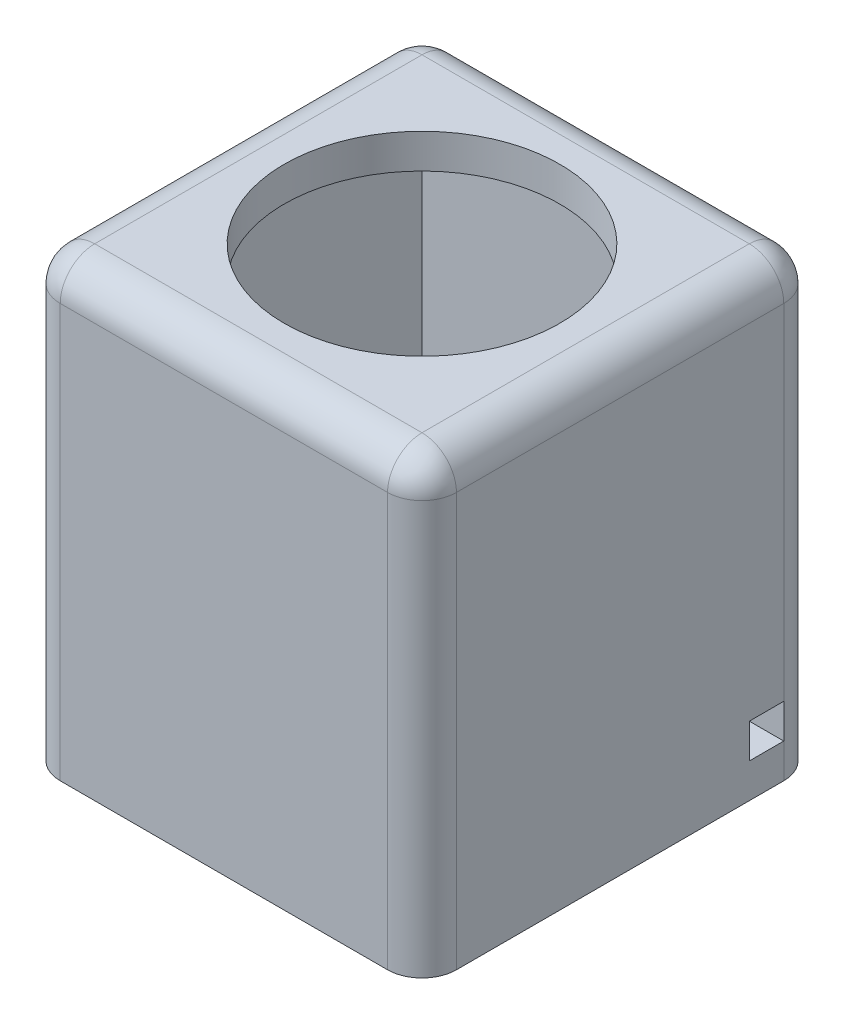
ISO-10303-21;
HEADER;
FILE_DESCRIPTION(('STEP AP214'),'2;1');
FILE_NAME('part.step','',(''),(''),'','','');
FILE_SCHEMA(('AUTOMOTIVE_DESIGN { 1 0 10303 214 1 1 1 1 }'));
ENDSEC;
DATA;
#1=APPLICATION_CONTEXT('core data for automotive mechanical design processes');
#2=APPLICATION_PROTOCOL_DEFINITION('international standard','automotive_design',2000,#1);
#3=PRODUCT_CONTEXT('',#1,'mechanical');
#4=PRODUCT('Part','Part','',(#3));
#5=PRODUCT_RELATED_PRODUCT_CATEGORY('part','',(#4));
#6=PRODUCT_DEFINITION_FORMATION('','',#4);
#7=PRODUCT_DEFINITION_CONTEXT('part definition',#1,'design');
#8=PRODUCT_DEFINITION('design','',#6,#7);
#9=PRODUCT_DEFINITION_SHAPE('','',#8);
#10=(LENGTH_UNIT() NAMED_UNIT(*) SI_UNIT(.MILLI.,.METRE.));
#11=(NAMED_UNIT(*) PLANE_ANGLE_UNIT() SI_UNIT($,.RADIAN.));
#12=(NAMED_UNIT(*) SI_UNIT($,.STERADIAN.) SOLID_ANGLE_UNIT());
#13=UNCERTAINTY_MEASURE_WITH_UNIT(LENGTH_MEASURE(1.E-05),#10,'distance_accuracy_value','');
#14=(GEOMETRIC_REPRESENTATION_CONTEXT(3) GLOBAL_UNCERTAINTY_ASSIGNED_CONTEXT((#13)) GLOBAL_UNIT_ASSIGNED_CONTEXT((#10,
#11,#12)) REPRESENTATION_CONTEXT('',''));
#15=CARTESIAN_POINT('',(0.,0.,0.));
#16=DIRECTION('',(0.,0.,1.));
#17=DIRECTION('',(1.,0.,0.));
#18=AXIS2_PLACEMENT_3D('',#15,#16,#17);
#19=CARTESIAN_POINT('',(9.50000000000002,-11.,-9.50000000000005));
#20=DIRECTION('',(1.,0.,0.));
#21=DIRECTION('',(0.,0.,-1.));
#22=AXIS2_PLACEMENT_3D('',#19,#20,#21);
#23=PLANE('',#22);
#24=DIRECTION('',(0.,1.,0.));
#25=VECTOR('',#24,1.);
#26=CARTESIAN_POINT('',(9.50000000000002,-11.,-7.50000000000005));
#27=LINE('',#26,#25);
#28=CARTESIAN_POINT('',(9.50000000000002,-11.,-7.50000000000005));
#29=VERTEX_POINT('',#28);
#30=CARTESIAN_POINT('',(9.50000000000002,-9.,-7.50000000000005));
#31=VERTEX_POINT('',#30);
#32=EDGE_CURVE('E48',#29,#31,#27,.T.);
#33=ORIENTED_EDGE('',*,*,#32,.F.);
#34=DIRECTION('',(0.,0.,-1.));
#35=VECTOR('',#34,1.);
#36=CARTESIAN_POINT('',(9.50000000000002,-11.,-9.50000000000005));
#37=LINE('',#36,#35);
#38=CARTESIAN_POINT('',(9.50000000000001,-11.,9.49999999999997));
#39=VERTEX_POINT('',#38);
#40=EDGE_CURVE('E162',#39,#29,#37,.T.);
#41=ORIENTED_EDGE('',*,*,#40,.F.);
#42=DIRECTION('',(0.,1.,0.));
#43=VECTOR('',#42,1.);
#44=CARTESIAN_POINT('',(9.50000000000001,-11.,9.49999999999997));
#45=LINE('',#44,#43);
#46=CARTESIAN_POINT('',(9.50000000000001,11.,9.49999999999997));
#47=VERTEX_POINT('',#46);
#48=EDGE_CURVE('E183',#39,#47,#45,.T.);
#49=ORIENTED_EDGE('',*,*,#48,.T.);
#50=DIRECTION('',(0.,0.,-1.));
#51=VECTOR('',#50,1.);
#52=CARTESIAN_POINT('',(9.50000000000002,11.,-9.50000000000005));
#53=LINE('',#52,#51);
#54=CARTESIAN_POINT('',(9.50000000000002,11.,-9.50000000000005));
#55=VERTEX_POINT('',#54);
#56=EDGE_CURVE('E206',#47,#55,#53,.T.);
#57=ORIENTED_EDGE('',*,*,#56,.T.);
#58=DIRECTION('',(0.,1.,0.));
#59=VECTOR('',#58,1.);
#60=CARTESIAN_POINT('',(9.50000000000002,-11.,-9.50000000000005));
#61=LINE('',#60,#59);
#62=CARTESIAN_POINT('',(9.50000000000002,-9.,-9.50000000000005));
#63=VERTEX_POINT('',#62);
#64=EDGE_CURVE('E182',#63,#55,#61,.T.);
#65=ORIENTED_EDGE('',*,*,#64,.F.);
#66=DIRECTION('',(0.,0.,-1.));
#67=VECTOR('',#66,1.);
#68=CARTESIAN_POINT('',(9.50000000000002,-9.,-9.50000000000005));
#69=LINE('',#68,#67);
#70=EDGE_CURVE('E157',#31,#63,#69,.T.);
#71=ORIENTED_EDGE('',*,*,#70,.F.);
#72=EDGE_LOOP('',(#33,#41,#49,#57,#65,#71));
#73=FACE_BOUND('',#72,.T.);
#74=ADVANCED_FACE('F33',(#73),#23,.F.);
#75=CARTESIAN_POINT('',(-9.50000000000001,-11.,9.49999999999998));
#76=DIRECTION('',(0.,0.,1.));
#77=DIRECTION('',(1.,0.,0.));
#78=AXIS2_PLACEMENT_3D('',#75,#76,#77);
#79=PLANE('',#78);
#80=ORIENTED_EDGE('',*,*,#48,.F.);
#81=DIRECTION('',(1.,0.,0.));
#82=VECTOR('',#81,1.);
#83=CARTESIAN_POINT('',(-9.50000000000001,-11.,9.49999999999998));
#84=LINE('',#83,#82);
#85=CARTESIAN_POINT('',(-9.50000000000001,-11.,9.49999999999998));
#86=VERTEX_POINT('',#85);
#87=EDGE_CURVE('E170',#86,#39,#84,.T.);
#88=ORIENTED_EDGE('',*,*,#87,.F.);
#89=DIRECTION('',(0.,1.,0.));
#90=VECTOR('',#89,1.);
#91=CARTESIAN_POINT('',(-9.50000000000001,-11.,9.49999999999998));
#92=LINE('',#91,#90);
#93=CARTESIAN_POINT('',(-9.50000000000001,11.,9.49999999999998));
#94=VERTEX_POINT('',#93);
#95=EDGE_CURVE('E186',#86,#94,#92,.T.);
#96=ORIENTED_EDGE('',*,*,#95,.T.);
#97=DIRECTION('',(1.,0.,0.));
#98=VECTOR('',#97,1.);
#99=CARTESIAN_POINT('',(-9.50000000000001,11.,9.49999999999998));
#100=LINE('',#99,#98);
#101=EDGE_CURVE('E171',#94,#47,#100,.T.);
#102=ORIENTED_EDGE('',*,*,#101,.T.);
#103=EDGE_LOOP('',(#80,#88,#96,#102));
#104=FACE_BOUND('',#103,.T.);
#105=ADVANCED_FACE('F316',(#104),#79,.F.);
#106=CARTESIAN_POINT('',(-9.49999999999999,-11.,-9.50000000000005));
#107=DIRECTION('',(-1.,0.,0.));
#108=DIRECTION('',(0.,0.,1.));
#109=AXIS2_PLACEMENT_3D('',#106,#107,#108);
#110=PLANE('',#109);
#111=ORIENTED_EDGE('',*,*,#95,.F.);
#112=DIRECTION('',(0.,0.,1.));
#113=VECTOR('',#112,1.);
#114=CARTESIAN_POINT('',(-9.49999999999999,-11.,-9.50000000000005));
#115=LINE('',#114,#113);
#116=CARTESIAN_POINT('',(-9.49999999999999,-11.,-9.50000000000005));
#117=VERTEX_POINT('',#116);
#118=EDGE_CURVE('E173',#117,#86,#115,.T.);
#119=ORIENTED_EDGE('',*,*,#118,.F.);
#120=DIRECTION('',(0.,1.,0.));
#121=VECTOR('',#120,1.);
#122=CARTESIAN_POINT('',(-9.49999999999999,-11.,-9.50000000000005));
#123=LINE('',#122,#121);
#124=CARTESIAN_POINT('',(-9.49999999999999,11.,-9.50000000000005));
#125=VERTEX_POINT('',#124);
#126=EDGE_CURVE('E188',#117,#125,#123,.T.);
#127=ORIENTED_EDGE('',*,*,#126,.T.);
#128=DIRECTION('',(0.,0.,1.));
#129=VECTOR('',#128,1.);
#130=CARTESIAN_POINT('',(-9.49999999999999,11.,-9.50000000000005));
#131=LINE('',#130,#129);
#132=EDGE_CURVE('E176',#125,#94,#131,.T.);
#133=ORIENTED_EDGE('',*,*,#132,.T.);
#134=EDGE_LOOP('',(#111,#119,#127,#133));
#135=FACE_BOUND('',#134,.T.);
#136=ADVANCED_FACE('F309',(#135),#110,.F.);
#137=CARTESIAN_POINT('',(-9.49999999999999,-11.,-9.50000000000005));
#138=DIRECTION('',(0.,0.,-1.));
#139=DIRECTION('',(-1.,0.,0.));
#140=AXIS2_PLACEMENT_3D('',#137,#138,#139);
#141=PLANE('',#140);
#142=ORIENTED_EDGE('',*,*,#126,.F.);
#143=DIRECTION('',(-1.,0.,0.));
#144=VECTOR('',#143,1.);
#145=CARTESIAN_POINT('',(-9.49999999999999,-11.,-9.50000000000005));
#146=LINE('',#145,#144);
#147=CARTESIAN_POINT('',(11.5,-11.,-9.50000000000005));
#148=VERTEX_POINT('',#147);
#149=EDGE_CURVE('E56',#148,#117,#146,.T.);
#150=ORIENTED_EDGE('',*,*,#149,.F.);
#151=DIRECTION('',(0.,1.,0.));
#152=VECTOR('',#151,1.);
#153=CARTESIAN_POINT('',(11.5,-13.,-9.50000000000005));
#154=LINE('',#153,#152);
#155=CARTESIAN_POINT('',(11.5,-9.,-9.50000000000005));
#156=VERTEX_POINT('',#155);
#157=EDGE_CURVE('E246',#148,#156,#154,.T.);
#158=ORIENTED_EDGE('',*,*,#157,.T.);
#159=DIRECTION('',(-1.,0.,0.));
#160=VECTOR('',#159,1.);
#161=CARTESIAN_POINT('',(22.5,-9.,-9.50000000000004));
#162=LINE('',#161,#160);
#163=EDGE_CURVE('E319',#156,#63,#162,.T.);
#164=ORIENTED_EDGE('',*,*,#163,.T.);
#165=ORIENTED_EDGE('',*,*,#64,.T.);
#166=DIRECTION('',(-1.,0.,0.));
#167=VECTOR('',#166,1.);
#168=CARTESIAN_POINT('',(-9.49999999999999,11.,-9.50000000000005));
#169=LINE('',#168,#167);
#170=EDGE_CURVE('E303',#55,#125,#169,.T.);
#171=ORIENTED_EDGE('',*,*,#170,.T.);
#172=EDGE_LOOP('',(#142,#150,#158,#164,#165,#171));
#173=FACE_BOUND('',#172,.T.);
#174=ADVANCED_FACE('F317',(#173),#141,.F.);
#175=CARTESIAN_POINT('',(0.,-11.,0.));
#176=DIRECTION('',(0.,1.,0.));
#177=DIRECTION('',(0.,0.,1.));
#178=AXIS2_PLACEMENT_3D('',#175,#176,#177);
#179=PLANE('',#178);
#180=CARTESIAN_POINT('',(0.,-11.,0.));
#181=DIRECTION('',(0.,1.,0.));
#182=DIRECTION('',(0.,0.,1.));
#183=AXIS2_PLACEMENT_3D('',#180,#181,#182);
#184=CIRCLE('',#183,2.25);
#185=CARTESIAN_POINT('',(0.,-11.,2.25));
#186=VERTEX_POINT('',#185);
#187=EDGE_CURVE('E211',#186,#186,#184,.T.);
#188=ORIENTED_EDGE('',*,*,#187,.F.);
#189=EDGE_LOOP('',(#188));
#190=FACE_BOUND('',#189,.T.);
#191=ORIENTED_EDGE('',*,*,#40,.T.);
#192=DIRECTION('',(-1.,0.,0.));
#193=VECTOR('',#192,1.);
#194=CARTESIAN_POINT('',(22.5,-11.,-7.50000000000004));
#195=LINE('',#194,#193);
#196=CARTESIAN_POINT('',(11.5,-11.,-7.50000000000005));
#197=VERTEX_POINT('',#196);
#198=EDGE_CURVE('E150',#197,#29,#195,.T.);
#199=ORIENTED_EDGE('',*,*,#198,.F.);
#200=DIRECTION('',(0.,0.,-1.));
#201=VECTOR('',#200,1.);
#202=CARTESIAN_POINT('',(11.5,-11.,-9.50000000000005));
#203=LINE('',#202,#201);
#204=EDGE_CURVE('E323',#197,#148,#203,.T.);
#205=ORIENTED_EDGE('',*,*,#204,.T.);
#206=ORIENTED_EDGE('',*,*,#149,.T.);
#207=ORIENTED_EDGE('',*,*,#118,.T.);
#208=ORIENTED_EDGE('',*,*,#87,.T.);
#209=EDGE_LOOP('',(#191,#199,#205,#206,#207,#208));
#210=FACE_BOUND('',#209,.T.);
#211=ADVANCED_FACE('F167',(#190,#210),#179,.T.);
#212=CARTESIAN_POINT('',(0.,11.,0.));
#213=DIRECTION('',(0.,1.,0.));
#214=DIRECTION('',(0.,0.,1.));
#215=AXIS2_PLACEMENT_3D('',#212,#213,#214);
#216=PLANE('',#215);
#217=CARTESIAN_POINT('',(0.,11.,0.));
#218=DIRECTION('',(0.,1.,0.));
#219=DIRECTION('',(0.,0.,1.));
#220=AXIS2_PLACEMENT_3D('',#217,#218,#219);
#221=CIRCLE('',#220,8.);
#222=CARTESIAN_POINT('',(0.,11.,8.));
#223=VERTEX_POINT('',#222);
#224=EDGE_CURVE('E203',#223,#223,#221,.T.);
#225=ORIENTED_EDGE('',*,*,#224,.T.);
#226=EDGE_LOOP('',(#225));
#227=FACE_BOUND('',#226,.T.);
#228=ORIENTED_EDGE('',*,*,#56,.F.);
#229=ORIENTED_EDGE('',*,*,#101,.F.);
#230=ORIENTED_EDGE('',*,*,#132,.F.);
#231=ORIENTED_EDGE('',*,*,#170,.F.);
#232=EDGE_LOOP('',(#228,#229,#230,#231));
#233=FACE_BOUND('',#232,.T.);
#234=ADVANCED_FACE('F314',(#227,#233),#216,.F.);
#235=CARTESIAN_POINT('',(0.,0.,0.));
#236=DIRECTION('',(0.,1.,0.));
#237=DIRECTION('',(0.,0.,1.));
#238=AXIS2_PLACEMENT_3D('',#235,#236,#237);
#239=CYLINDRICAL_SURFACE('',#238,8.);
#240=CARTESIAN_POINT('',(0.,13.,0.));
#241=DIRECTION('',(0.,1.,0.));
#242=DIRECTION('',(0.,0.,1.));
#243=AXIS2_PLACEMENT_3D('',#240,#241,#242);
#244=CIRCLE('',#243,8.);
#245=CARTESIAN_POINT('',(0.,13.,8.));
#246=VERTEX_POINT('',#245);
#247=EDGE_CURVE('E207',#246,#246,#244,.T.);
#248=CARTESIAN_POINT('',(0.,13.,8.));
#249=CARTESIAN_POINT('',(0.,12.9791666666667,8.));
#250=CARTESIAN_POINT('',(0.,12.9583333333333,8.));
#251=CARTESIAN_POINT('',(0.,12.9166666666667,8.));
#252=CARTESIAN_POINT('',(0.,12.8958333333333,8.));
#253=CARTESIAN_POINT('',(0.,12.8541666666667,8.));
#254=CARTESIAN_POINT('',(0.,12.8333333333333,8.));
#255=CARTESIAN_POINT('',(0.,12.7916666666667,8.));
#256=CARTESIAN_POINT('',(0.,12.7708333333333,8.));
#257=CARTESIAN_POINT('',(0.,12.7291666666667,8.));
#258=CARTESIAN_POINT('',(0.,12.7083333333333,8.));
#259=CARTESIAN_POINT('',(0.,12.6666666666667,8.));
#260=CARTESIAN_POINT('',(0.,12.6458333333333,8.));
#261=CARTESIAN_POINT('',(0.,12.6041666666667,8.));
#262=CARTESIAN_POINT('',(0.,12.5833333333333,8.));
#263=CARTESIAN_POINT('',(0.,12.5416666666667,8.));
#264=CARTESIAN_POINT('',(0.,12.5208333333333,8.));
#265=CARTESIAN_POINT('',(0.,12.4791666666667,8.));
#266=CARTESIAN_POINT('',(0.,12.4583333333333,8.));
#267=CARTESIAN_POINT('',(0.,12.4166666666667,8.));
#268=CARTESIAN_POINT('',(0.,12.3958333333333,8.));
#269=CARTESIAN_POINT('',(0.,12.3541666666667,8.));
#270=CARTESIAN_POINT('',(0.,12.3333333333333,8.));
#271=CARTESIAN_POINT('',(0.,12.2916666666667,8.));
#272=CARTESIAN_POINT('',(0.,12.2708333333333,8.));
#273=CARTESIAN_POINT('',(0.,12.2291666666667,8.));
#274=CARTESIAN_POINT('',(0.,12.2083333333333,8.));
#275=CARTESIAN_POINT('',(0.,12.1666666666667,8.));
#276=CARTESIAN_POINT('',(0.,12.1458333333333,8.));
#277=CARTESIAN_POINT('',(0.,12.1041666666667,8.));
#278=CARTESIAN_POINT('',(0.,12.0833333333333,8.));
#279=CARTESIAN_POINT('',(0.,12.0416666666667,8.));
#280=CARTESIAN_POINT('',(0.,12.0208333333333,8.));
#281=CARTESIAN_POINT('',(0.,11.9791666666667,8.));
#282=CARTESIAN_POINT('',(0.,11.9583333333333,8.));
#283=CARTESIAN_POINT('',(0.,11.9166666666667,8.));
#284=CARTESIAN_POINT('',(0.,11.8958333333333,8.));
#285=CARTESIAN_POINT('',(0.,11.8541666666667,8.));
#286=CARTESIAN_POINT('',(0.,11.8333333333333,8.));
#287=CARTESIAN_POINT('',(0.,11.7916666666667,8.));
#288=CARTESIAN_POINT('',(0.,11.7708333333333,8.));
#289=CARTESIAN_POINT('',(0.,11.7291666666667,8.));
#290=CARTESIAN_POINT('',(0.,11.7083333333333,8.));
#291=CARTESIAN_POINT('',(0.,11.6666666666667,8.));
#292=CARTESIAN_POINT('',(0.,11.6458333333333,8.));
#293=CARTESIAN_POINT('',(0.,11.6041666666667,8.));
#294=CARTESIAN_POINT('',(0.,11.5833333333333,8.));
#295=CARTESIAN_POINT('',(0.,11.5416666666667,8.));
#296=CARTESIAN_POINT('',(0.,11.5208333333333,8.));
#297=CARTESIAN_POINT('',(0.,11.4791666666667,8.));
#298=CARTESIAN_POINT('',(0.,11.4583333333333,8.));
#299=CARTESIAN_POINT('',(0.,11.4166666666667,8.));
#300=CARTESIAN_POINT('',(0.,11.3958333333333,8.));
#301=CARTESIAN_POINT('',(0.,11.3541666666667,8.));
#302=CARTESIAN_POINT('',(0.,11.3333333333333,8.));
#303=CARTESIAN_POINT('',(0.,11.2916666666667,8.));
#304=CARTESIAN_POINT('',(0.,11.2708333333333,8.));
#305=CARTESIAN_POINT('',(0.,11.2291666666667,8.));
#306=CARTESIAN_POINT('',(0.,11.2083333333333,8.));
#307=CARTESIAN_POINT('',(0.,11.1666666666667,8.));
#308=CARTESIAN_POINT('',(0.,11.1458333333333,8.));
#309=CARTESIAN_POINT('',(0.,11.1041666666667,8.));
#310=CARTESIAN_POINT('',(0.,11.0833333333333,8.));
#311=CARTESIAN_POINT('',(0.,11.0416666666667,8.));
#312=CARTESIAN_POINT('',(0.,11.0208333333333,8.));
#313=CARTESIAN_POINT('',(0.,11.,8.));
#314=B_SPLINE_CURVE_WITH_KNOTS('',3,(#248,#249,#250,#251,#252,#253,#254,#255,#256,#257,#258,
#259,#260,#261,#262,#263,#264,#265,#266,#267,#268,#269,#270,#271,#272,#273,#274,#275,#276,#277,
#278,#279,#280,#281,#282,#283,#284,#285,#286,#287,#288,#289,#290,#291,#292,#293,#294,#295,#296,
#297,#298,#299,#300,#301,#302,#303,#304,#305,#306,#307,#308,#309,#310,#311,#312,#313),
.UNSPECIFIED.,.F.,.F.,(4,2,2,2,2,2,2,2,2,2,2,2,2,2,2,2,2,2,2,2,2,2,2,2,2,2,2,2,2,2,2,2,4),(0.,
0.0625000000000001,0.125,0.1875,0.25,0.3125,0.375,0.4375,0.5,0.5625,0.625000000000001,
0.687500000000001,0.750000000000001,0.812500000000001,0.875000000000001,0.937500000000001,1.,
1.0625,1.125,1.1875,1.25,1.3125,1.375,1.4375,1.5,1.5625,1.625,1.6875,1.75,1.8125,1.875,1.9375,
2.),.UNSPECIFIED.);
#315=EDGE_CURVE('BSEAM431',#246,#223,#314,.T.);
#316=ORIENTED_EDGE('',*,*,#247,.T.);
#317=ORIENTED_EDGE('',*,*,#224,.F.);
#318=ORIENTED_EDGE('',*,*,#315,.T.);
#319=ORIENTED_EDGE('',*,*,#315,.F.);
#320=EDGE_LOOP('',(#316,#318,#317,#319));
#321=FACE_BOUND('',#320,.T.);
#322=ADVANCED_FACE('F431',(#321),#239,.F.);
#323=CARTESIAN_POINT('',(11.5,-13.,-9.50000000000005));
#324=DIRECTION('',(1.,0.,0.));
#325=DIRECTION('',(0.,0.,-1.));
#326=AXIS2_PLACEMENT_3D('',#323,#324,#325);
#327=PLANE('',#326);
#328=DIRECTION('',(0.,0.,1.));
#329=VECTOR('',#328,1.);
#330=CARTESIAN_POINT('',(11.5,-9.,-9.50000000000005));
#331=LINE('',#330,#329);
#332=CARTESIAN_POINT('',(11.5,-9.,-7.50000000000005));
#333=VERTEX_POINT('',#332);
#334=EDGE_CURVE('E258',#156,#333,#331,.T.);
#335=ORIENTED_EDGE('',*,*,#334,.F.);
#336=CARTESIAN_POINT('',(11.5,11.,-9.50000000000005));
#337=VERTEX_POINT('',#336);
#338=EDGE_CURVE('E241',#156,#337,#154,.T.);
#339=ORIENTED_EDGE('',*,*,#338,.T.);
#340=DIRECTION('',(0.,0.,-1.));
#341=VECTOR('',#340,1.);
#342=CARTESIAN_POINT('',(11.5,11.,-9.50000000000005));
#343=LINE('',#342,#341);
#344=CARTESIAN_POINT('',(11.5,11.,9.49999999999997));
#345=VERTEX_POINT('',#344);
#346=EDGE_CURVE('E245',#337,#345,#343,.F.);
#347=ORIENTED_EDGE('',*,*,#346,.T.);
#348=DIRECTION('',(0.,1.,0.));
#349=VECTOR('',#348,1.);
#350=CARTESIAN_POINT('',(11.5,-13.,9.49999999999997));
#351=LINE('',#350,#349);
#352=CARTESIAN_POINT('',(11.5,-13.,9.49999999999997));
#353=VERTEX_POINT('',#352);
#354=EDGE_CURVE('E248',#345,#353,#351,.F.);
#355=ORIENTED_EDGE('',*,*,#354,.T.);
#356=DIRECTION('',(0.,0.,-1.));
#357=VECTOR('',#356,1.);
#358=CARTESIAN_POINT('',(11.5,-13.,-9.50000000000005));
#359=LINE('',#358,#357);
#360=CARTESIAN_POINT('',(11.5,-13.,-9.50000000000005));
#361=VERTEX_POINT('',#360);
#362=EDGE_CURVE('E185',#353,#361,#359,.T.);
#363=ORIENTED_EDGE('',*,*,#362,.T.);
#364=EDGE_CURVE('E242',#361,#148,#154,.T.);
#365=ORIENTED_EDGE('',*,*,#364,.T.);
#366=ORIENTED_EDGE('',*,*,#204,.F.);
#367=DIRECTION('',(0.,-1.,0.));
#368=VECTOR('',#367,1.);
#369=CARTESIAN_POINT('',(11.5,-13.,-7.50000000000005));
#370=LINE('',#369,#368);
#371=EDGE_CURVE('E11',#333,#197,#370,.T.);
#372=ORIENTED_EDGE('',*,*,#371,.F.);
#373=EDGE_LOOP('',(#335,#339,#347,#355,#363,#365,#366,#372));
#374=FACE_BOUND('',#373,.T.);
#375=ADVANCED_FACE('F330',(#374),#327,.T.);
#376=CARTESIAN_POINT('',(-9.50000000000001,-13.,11.5));
#377=DIRECTION('',(0.,0.,1.));
#378=DIRECTION('',(1.,0.,0.));
#379=AXIS2_PLACEMENT_3D('',#376,#377,#378);
#380=PLANE('',#379);
#381=DIRECTION('',(1.,0.,0.));
#382=VECTOR('',#381,1.);
#383=CARTESIAN_POINT('',(-9.50000000000001,11.,11.5));
#384=LINE('',#383,#382);
#385=CARTESIAN_POINT('',(9.50000000000001,11.,11.5));
#386=VERTEX_POINT('',#385);
#387=CARTESIAN_POINT('',(-9.50000000000001,11.,11.5));
#388=VERTEX_POINT('',#387);
#389=EDGE_CURVE('E220',#386,#388,#384,.F.);
#390=ORIENTED_EDGE('',*,*,#389,.T.);
#391=DIRECTION('',(0.,1.,0.));
#392=VECTOR('',#391,1.);
#393=CARTESIAN_POINT('',(-9.50000000000001,-13.,11.5));
#394=LINE('',#393,#392);
#395=CARTESIAN_POINT('',(-9.50000000000001,-13.,11.5));
#396=VERTEX_POINT('',#395);
#397=EDGE_CURVE('E222',#388,#396,#394,.F.);
#398=ORIENTED_EDGE('',*,*,#397,.T.);
#399=DIRECTION('',(1.,0.,0.));
#400=VECTOR('',#399,1.);
#401=CARTESIAN_POINT('',(-9.50000000000001,-13.,11.5));
#402=LINE('',#401,#400);
#403=CARTESIAN_POINT('',(9.50000000000001,-13.,11.5));
#404=VERTEX_POINT('',#403);
#405=EDGE_CURVE('E199',#396,#404,#402,.T.);
#406=ORIENTED_EDGE('',*,*,#405,.T.);
#407=DIRECTION('',(0.,1.,0.));
#408=VECTOR('',#407,1.);
#409=CARTESIAN_POINT('',(9.50000000000001,-13.,11.5));
#410=LINE('',#409,#408);
#411=EDGE_CURVE('E218',#404,#386,#410,.T.);
#412=ORIENTED_EDGE('',*,*,#411,.T.);
#413=EDGE_LOOP('',(#390,#398,#406,#412));
#414=FACE_BOUND('',#413,.T.);
#415=ADVANCED_FACE('F394',(#414),#380,.T.);
#416=CARTESIAN_POINT('',(-11.5,-13.,-9.50000000000005));
#417=DIRECTION('',(-1.,0.,0.));
#418=DIRECTION('',(0.,0.,1.));
#419=AXIS2_PLACEMENT_3D('',#416,#417,#418);
#420=PLANE('',#419);
#421=DIRECTION('',(0.,0.,1.));
#422=VECTOR('',#421,1.);
#423=CARTESIAN_POINT('',(-11.5,-13.,-9.50000000000005));
#424=LINE('',#423,#422);
#425=CARTESIAN_POINT('',(-11.5,-13.,-9.50000000000005));
#426=VERTEX_POINT('',#425);
#427=CARTESIAN_POINT('',(-11.5,-13.,9.49999999999998));
#428=VERTEX_POINT('',#427);
#429=EDGE_CURVE('E196',#426,#428,#424,.T.);
#430=ORIENTED_EDGE('',*,*,#429,.T.);
#431=DIRECTION('',(0.,1.,0.));
#432=VECTOR('',#431,1.);
#433=CARTESIAN_POINT('',(-11.5,-13.,9.49999999999998));
#434=LINE('',#433,#432);
#435=CARTESIAN_POINT('',(-11.5,11.,9.49999999999998));
#436=VERTEX_POINT('',#435);
#437=EDGE_CURVE('E215',#428,#436,#434,.T.);
#438=ORIENTED_EDGE('',*,*,#437,.T.);
#439=DIRECTION('',(0.,0.,1.));
#440=VECTOR('',#439,1.);
#441=CARTESIAN_POINT('',(-11.5,11.,-9.50000000000005));
#442=LINE('',#441,#440);
#443=CARTESIAN_POINT('',(-11.5,11.,-9.50000000000005));
#444=VERTEX_POINT('',#443);
#445=EDGE_CURVE('E202',#436,#444,#442,.F.);
#446=ORIENTED_EDGE('',*,*,#445,.T.);
#447=DIRECTION('',(0.,1.,0.));
#448=VECTOR('',#447,1.);
#449=CARTESIAN_POINT('',(-11.5,-13.,-9.50000000000005));
#450=LINE('',#449,#448);
#451=EDGE_CURVE('E213',#444,#426,#450,.F.);
#452=ORIENTED_EDGE('',*,*,#451,.T.);
#453=EDGE_LOOP('',(#430,#438,#446,#452));
#454=FACE_BOUND('',#453,.T.);
#455=ADVANCED_FACE('F396',(#454),#420,.T.);
#456=CARTESIAN_POINT('',(-9.49999999999999,-13.,-11.5));
#457=DIRECTION('',(0.,0.,-1.));
#458=DIRECTION('',(-1.,0.,0.));
#459=AXIS2_PLACEMENT_3D('',#456,#457,#458);
#460=PLANE('',#459);
#461=DIRECTION('',(-1.,0.,0.));
#462=VECTOR('',#461,1.);
#463=CARTESIAN_POINT('',(-9.49999999999999,11.,-11.5));
#464=LINE('',#463,#462);
#465=CARTESIAN_POINT('',(-9.49999999999999,11.,-11.5));
#466=VERTEX_POINT('',#465);
#467=CARTESIAN_POINT('',(9.50000000000002,11.,-11.5));
#468=VERTEX_POINT('',#467);
#469=EDGE_CURVE('E250',#466,#468,#464,.F.);
#470=ORIENTED_EDGE('',*,*,#469,.T.);
#471=DIRECTION('',(0.,1.,0.));
#472=VECTOR('',#471,1.);
#473=CARTESIAN_POINT('',(9.50000000000002,-13.,-11.5));
#474=LINE('',#473,#472);
#475=CARTESIAN_POINT('',(9.50000000000002,-13.,-11.5));
#476=VERTEX_POINT('',#475);
#477=EDGE_CURVE('E41',#468,#476,#474,.F.);
#478=ORIENTED_EDGE('',*,*,#477,.T.);
#479=DIRECTION('',(-1.,0.,0.));
#480=VECTOR('',#479,1.);
#481=CARTESIAN_POINT('',(-9.49999999999999,-13.,-11.5));
#482=LINE('',#481,#480);
#483=CARTESIAN_POINT('',(-9.49999999999999,-13.,-11.5));
#484=VERTEX_POINT('',#483);
#485=EDGE_CURVE('E193',#476,#484,#482,.T.);
#486=ORIENTED_EDGE('',*,*,#485,.T.);
#487=DIRECTION('',(0.,1.,0.));
#488=VECTOR('',#487,1.);
#489=CARTESIAN_POINT('',(-9.49999999999999,-13.,-11.5));
#490=LINE('',#489,#488);
#491=EDGE_CURVE('E252',#484,#466,#490,.T.);
#492=ORIENTED_EDGE('',*,*,#491,.T.);
#493=EDGE_LOOP('',(#470,#478,#486,#492));
#494=FACE_BOUND('',#493,.T.);
#495=ADVANCED_FACE('F361',(#494),#460,.T.);
#496=CARTESIAN_POINT('',(0.,-13.,0.));
#497=DIRECTION('',(0.,1.,0.));
#498=DIRECTION('',(0.,0.,1.));
#499=AXIS2_PLACEMENT_3D('',#496,#497,#498);
#500=PLANE('',#499);
#501=CARTESIAN_POINT('',(0.,-13.,0.));
#502=DIRECTION('',(0.,1.,0.));
#503=DIRECTION('',(0.,0.,1.));
#504=AXIS2_PLACEMENT_3D('',#501,#502,#503);
#505=CIRCLE('',#504,2.25);
#506=CARTESIAN_POINT('',(0.,-13.,2.25));
#507=VERTEX_POINT('',#506);
#508=EDGE_CURVE('E208',#507,#507,#505,.T.);
#509=ORIENTED_EDGE('',*,*,#508,.T.);
#510=EDGE_LOOP('',(#509));
#511=FACE_BOUND('',#510,.T.);
#512=ORIENTED_EDGE('',*,*,#405,.F.);
#513=CARTESIAN_POINT('',(-9.50000000000001,-13.,9.49999999999998));
#514=DIRECTION('',(0.,1.,0.));
#515=DIRECTION('',(0.,0.,1.));
#516=AXIS2_PLACEMENT_3D('',#513,#514,#515);
#517=CIRCLE('',#516,2.);
#518=EDGE_CURVE('E230',#396,#428,#517,.F.);
#519=ORIENTED_EDGE('',*,*,#518,.T.);
#520=ORIENTED_EDGE('',*,*,#429,.F.);
#521=CARTESIAN_POINT('',(-9.49999999999999,-13.,-9.50000000000005));
#522=DIRECTION('',(0.,1.,0.));
#523=DIRECTION('',(0.,0.,1.));
#524=AXIS2_PLACEMENT_3D('',#521,#522,#523);
#525=CIRCLE('',#524,2.);
#526=EDGE_CURVE('E224',#426,#484,#525,.F.);
#527=ORIENTED_EDGE('',*,*,#526,.T.);
#528=ORIENTED_EDGE('',*,*,#485,.F.);
#529=CARTESIAN_POINT('',(9.50000000000002,-13.,-9.50000000000005));
#530=DIRECTION('',(0.,1.,0.));
#531=DIRECTION('',(0.,0.,1.));
#532=AXIS2_PLACEMENT_3D('',#529,#530,#531);
#533=CIRCLE('',#532,2.);
#534=EDGE_CURVE('E226',#476,#361,#533,.F.);
#535=ORIENTED_EDGE('',*,*,#534,.T.);
#536=ORIENTED_EDGE('',*,*,#362,.F.);
#537=CARTESIAN_POINT('',(9.50000000000001,-13.,9.49999999999997));
#538=DIRECTION('',(0.,1.,0.));
#539=DIRECTION('',(0.,0.,1.));
#540=AXIS2_PLACEMENT_3D('',#537,#538,#539);
#541=CIRCLE('',#540,2.);
#542=EDGE_CURVE('E228',#353,#404,#541,.F.);
#543=ORIENTED_EDGE('',*,*,#542,.T.);
#544=EDGE_LOOP('',(#512,#519,#520,#527,#528,#535,#536,#543));
#545=FACE_BOUND('',#544,.T.);
#546=ADVANCED_FACE('F355',(#511,#545),#500,.F.);
#547=CARTESIAN_POINT('',(0.,13.,0.));
#548=DIRECTION('',(0.,1.,0.));
#549=DIRECTION('',(0.,0.,1.));
#550=AXIS2_PLACEMENT_3D('',#547,#548,#549);
#551=PLANE('',#550);
#552=DIRECTION('',(0.,0.,1.));
#553=VECTOR('',#552,1.);
#554=CARTESIAN_POINT('',(-9.5,13.,0.));
#555=LINE('',#554,#553);
#556=CARTESIAN_POINT('',(-9.49999999999999,13.,-9.50000000000005));
#557=VERTEX_POINT('',#556);
#558=CARTESIAN_POINT('',(-9.50000000000001,13.,9.49999999999998));
#559=VERTEX_POINT('',#558);
#560=EDGE_CURVE('E232',#557,#559,#555,.T.);
#561=ORIENTED_EDGE('',*,*,#560,.T.);
#562=DIRECTION('',(1.,0.,0.));
#563=VECTOR('',#562,1.);
#564=CARTESIAN_POINT('',(0.,13.,9.49999999999997));
#565=LINE('',#564,#563);
#566=CARTESIAN_POINT('',(9.50000000000001,13.,9.49999999999997));
#567=VERTEX_POINT('',#566);
#568=EDGE_CURVE('E238',#559,#567,#565,.T.);
#569=ORIENTED_EDGE('',*,*,#568,.T.);
#570=DIRECTION('',(0.,0.,-1.));
#571=VECTOR('',#570,1.);
#572=CARTESIAN_POINT('',(9.50000000000002,13.,0.));
#573=LINE('',#572,#571);
#574=CARTESIAN_POINT('',(9.50000000000002,13.,-9.50000000000005));
#575=VERTEX_POINT('',#574);
#576=EDGE_CURVE('E236',#567,#575,#573,.T.);
#577=ORIENTED_EDGE('',*,*,#576,.T.);
#578=DIRECTION('',(-1.,0.,0.));
#579=VECTOR('',#578,1.);
#580=CARTESIAN_POINT('',(0.,13.,-9.50000000000005));
#581=LINE('',#580,#579);
#582=EDGE_CURVE('E234',#575,#557,#581,.T.);
#583=ORIENTED_EDGE('',*,*,#582,.T.);
#584=EDGE_LOOP('',(#561,#569,#577,#583));
#585=FACE_BOUND('',#584,.T.);
#586=ORIENTED_EDGE('',*,*,#247,.F.);
#587=EDGE_LOOP('',(#586));
#588=FACE_BOUND('',#587,.T.);
#589=ADVANCED_FACE('F375',(#585,#588),#551,.T.);
#590=CARTESIAN_POINT('',(0.,-24.,0.));
#591=DIRECTION('',(0.,1.,0.));
#592=DIRECTION('',(0.,0.,1.));
#593=AXIS2_PLACEMENT_3D('',#590,#591,#592);
#594=CYLINDRICAL_SURFACE('',#593,2.25);
#595=CARTESIAN_POINT('',(0.,-11.,2.25));
#596=CARTESIAN_POINT('',(0.,-11.0208333333333,2.25));
#597=CARTESIAN_POINT('',(0.,-11.0416666666667,2.25));
#598=CARTESIAN_POINT('',(0.,-11.0833333333333,2.25));
#599=CARTESIAN_POINT('',(0.,-11.1041666666667,2.25));
#600=CARTESIAN_POINT('',(0.,-11.1458333333333,2.25));
#601=CARTESIAN_POINT('',(0.,-11.1666666666667,2.25));
#602=CARTESIAN_POINT('',(0.,-11.2083333333333,2.25));
#603=CARTESIAN_POINT('',(0.,-11.2291666666667,2.25));
#604=CARTESIAN_POINT('',(0.,-11.2708333333333,2.25));
#605=CARTESIAN_POINT('',(0.,-11.2916666666667,2.25));
#606=CARTESIAN_POINT('',(0.,-11.3333333333333,2.25));
#607=CARTESIAN_POINT('',(0.,-11.3541666666667,2.25));
#608=CARTESIAN_POINT('',(0.,-11.3958333333333,2.25));
#609=CARTESIAN_POINT('',(0.,-11.4166666666667,2.25));
#610=CARTESIAN_POINT('',(0.,-11.4583333333333,2.25));
#611=CARTESIAN_POINT('',(0.,-11.4791666666667,2.25));
#612=CARTESIAN_POINT('',(0.,-11.5208333333333,2.25));
#613=CARTESIAN_POINT('',(0.,-11.5416666666667,2.25));
#614=CARTESIAN_POINT('',(0.,-11.5833333333333,2.25));
#615=CARTESIAN_POINT('',(0.,-11.6041666666667,2.25));
#616=CARTESIAN_POINT('',(0.,-11.6458333333333,2.25));
#617=CARTESIAN_POINT('',(0.,-11.6666666666667,2.25));
#618=CARTESIAN_POINT('',(0.,-11.7083333333333,2.25));
#619=CARTESIAN_POINT('',(0.,-11.7291666666667,2.25));
#620=CARTESIAN_POINT('',(0.,-11.7708333333333,2.25));
#621=CARTESIAN_POINT('',(0.,-11.7916666666667,2.25));
#622=CARTESIAN_POINT('',(0.,-11.8333333333333,2.25));
#623=CARTESIAN_POINT('',(0.,-11.8541666666667,2.25));
#624=CARTESIAN_POINT('',(0.,-11.8958333333333,2.25));
#625=CARTESIAN_POINT('',(0.,-11.9166666666667,2.25));
#626=CARTESIAN_POINT('',(0.,-11.9583333333333,2.25));
#627=CARTESIAN_POINT('',(0.,-11.9791666666667,2.25));
#628=CARTESIAN_POINT('',(0.,-12.0208333333333,2.25));
#629=CARTESIAN_POINT('',(0.,-12.0416666666667,2.25));
#630=CARTESIAN_POINT('',(0.,-12.0833333333333,2.25));
#631=CARTESIAN_POINT('',(0.,-12.1041666666667,2.25));
#632=CARTESIAN_POINT('',(0.,-12.1458333333333,2.25));
#633=CARTESIAN_POINT('',(0.,-12.1666666666667,2.25));
#634=CARTESIAN_POINT('',(0.,-12.2083333333333,2.25));
#635=CARTESIAN_POINT('',(0.,-12.2291666666667,2.25));
#636=CARTESIAN_POINT('',(0.,-12.2708333333333,2.25));
#637=CARTESIAN_POINT('',(0.,-12.2916666666667,2.25));
#638=CARTESIAN_POINT('',(0.,-12.3333333333333,2.25));
#639=CARTESIAN_POINT('',(0.,-12.3541666666667,2.25));
#640=CARTESIAN_POINT('',(0.,-12.3958333333333,2.25));
#641=CARTESIAN_POINT('',(0.,-12.4166666666667,2.25));
#642=CARTESIAN_POINT('',(0.,-12.4583333333333,2.25));
#643=CARTESIAN_POINT('',(0.,-12.4791666666667,2.25));
#644=CARTESIAN_POINT('',(0.,-12.5208333333333,2.25));
#645=CARTESIAN_POINT('',(0.,-12.5416666666667,2.25));
#646=CARTESIAN_POINT('',(0.,-12.5833333333333,2.25));
#647=CARTESIAN_POINT('',(0.,-12.6041666666667,2.25));
#648=CARTESIAN_POINT('',(0.,-12.6458333333333,2.25));
#649=CARTESIAN_POINT('',(0.,-12.6666666666667,2.25));
#650=CARTESIAN_POINT('',(0.,-12.7083333333333,2.25));
#651=CARTESIAN_POINT('',(0.,-12.7291666666667,2.25));
#652=CARTESIAN_POINT('',(0.,-12.7708333333333,2.25));
#653=CARTESIAN_POINT('',(0.,-12.7916666666667,2.25));
#654=CARTESIAN_POINT('',(0.,-12.8333333333333,2.25));
#655=CARTESIAN_POINT('',(0.,-12.8541666666667,2.25));
#656=CARTESIAN_POINT('',(0.,-12.8958333333333,2.25));
#657=CARTESIAN_POINT('',(0.,-12.9166666666667,2.25));
#658=CARTESIAN_POINT('',(0.,-12.9583333333333,2.25));
#659=CARTESIAN_POINT('',(0.,-12.9791666666667,2.25));
#660=CARTESIAN_POINT('',(0.,-13.,2.25));
#661=B_SPLINE_CURVE_WITH_KNOTS('',3,(#595,#596,#597,#598,#599,#600,#601,#602,#603,#604,#605,
#606,#607,#608,#609,#610,#611,#612,#613,#614,#615,#616,#617,#618,#619,#620,#621,#622,#623,#624,
#625,#626,#627,#628,#629,#630,#631,#632,#633,#634,#635,#636,#637,#638,#639,#640,#641,#642,#643,
#644,#645,#646,#647,#648,#649,#650,#651,#652,#653,#654,#655,#656,#657,#658,#659,#660),
.UNSPECIFIED.,.F.,.F.,(4,2,2,2,2,2,2,2,2,2,2,2,2,2,2,2,2,2,2,2,2,2,2,2,2,2,2,2,2,2,2,2,4),(0.,
0.0625000000000001,0.125,0.1875,0.25,0.3125,0.375,0.4375,0.5,0.562499999999999,
0.624999999999999,0.687499999999999,0.749999999999999,0.812499999999999,0.874999999999999,
0.937499999999999,0.999999999999999,1.0625,1.125,1.1875,1.25,1.3125,1.375,1.4375,1.5,1.5625,
1.625,1.6875,1.75,1.8125,1.875,1.9375,2.),.UNSPECIFIED.);
#662=EDGE_CURVE('BSEAM416',#186,#507,#661,.T.);
#663=ORIENTED_EDGE('',*,*,#187,.T.);
#664=ORIENTED_EDGE('',*,*,#508,.F.);
#665=ORIENTED_EDGE('',*,*,#662,.T.);
#666=ORIENTED_EDGE('',*,*,#662,.F.);
#667=EDGE_LOOP('',(#663,#665,#664,#666));
#668=FACE_BOUND('',#667,.T.);
#669=ADVANCED_FACE('F416',(#668),#594,.F.);
#670=CARTESIAN_POINT('',(9.50000000000002,-13.,-9.50000000000005));
#671=DIRECTION('',(0.,1.,0.));
#672=DIRECTION('',(0.,0.,1.));
#673=AXIS2_PLACEMENT_3D('',#670,#671,#672);
#674=CYLINDRICAL_SURFACE('',#673,2.);
#675=CARTESIAN_POINT('',(9.50000000000002,11.,-9.50000000000005));
#676=DIRECTION('',(0.,1.,0.));
#677=DIRECTION('',(0.,0.,1.));
#678=AXIS2_PLACEMENT_3D('',#675,#676,#677);
#679=CIRCLE('',#678,2.);
#680=EDGE_CURVE('E286',#337,#468,#679,.T.);
#681=ORIENTED_EDGE('',*,*,#680,.F.);
#682=ORIENTED_EDGE('',*,*,#338,.F.);
#683=ORIENTED_EDGE('',*,*,#157,.F.);
#684=ORIENTED_EDGE('',*,*,#364,.F.);
#685=ORIENTED_EDGE('',*,*,#534,.F.);
#686=ORIENTED_EDGE('',*,*,#477,.F.);
#687=EDGE_LOOP('',(#681,#682,#683,#684,#685,#686));
#688=FACE_BOUND('',#687,.T.);
#689=ADVANCED_FACE('F35',(#688),#674,.T.);
#690=CARTESIAN_POINT('',(9.50000000000002,11.,-9.50000000000005));
#691=DIRECTION('',(0.,0.,1.));
#692=DIRECTION('',(1.,0.,0.));
#693=AXIS2_PLACEMENT_3D('',#690,#691,#692);
#694=SPHERICAL_SURFACE('',#693,2.);
#695=CARTESIAN_POINT('',(9.50000000000002,11.,-9.50000000000005));
#696=DIRECTION('',(0.,0.,-1.));
#697=DIRECTION('',(-1.,0.,0.));
#698=AXIS2_PLACEMENT_3D('',#695,#696,#697);
#699=CIRCLE('',#698,2.);
#700=EDGE_CURVE('E281',#337,#575,#699,.F.);
#701=ORIENTED_EDGE('',*,*,#700,.F.);
#702=ORIENTED_EDGE('',*,*,#680,.T.);
#703=CARTESIAN_POINT('',(9.50000000000002,11.,-9.50000000000005));
#704=DIRECTION('',(1.,0.,0.));
#705=DIRECTION('',(0.,0.,-1.));
#706=AXIS2_PLACEMENT_3D('',#703,#704,#705);
#707=CIRCLE('',#706,2.);
#708=EDGE_CURVE('E284',#575,#468,#707,.F.);
#709=ORIENTED_EDGE('',*,*,#708,.F.);
#710=EDGE_LOOP('',(#701,#702,#709));
#711=FACE_BOUND('',#710,.T.);
#712=ADVANCED_FACE('F338',(#711),#694,.T.);
#713=CARTESIAN_POINT('',(-9.49999999999999,-13.,-9.50000000000005));
#714=DIRECTION('',(0.,1.,0.));
#715=DIRECTION('',(0.,0.,1.));
#716=AXIS2_PLACEMENT_3D('',#713,#714,#715);
#717=CYLINDRICAL_SURFACE('',#716,2.);
#718=ORIENTED_EDGE('',*,*,#526,.F.);
#719=ORIENTED_EDGE('',*,*,#451,.F.);
#720=CARTESIAN_POINT('',(-9.49999999999999,11.,-9.50000000000005));
#721=DIRECTION('',(0.,1.,0.));
#722=DIRECTION('',(0.,0.,1.));
#723=AXIS2_PLACEMENT_3D('',#720,#721,#722);
#724=CIRCLE('',#723,2.);
#725=EDGE_CURVE('E278',#466,#444,#724,.T.);
#726=ORIENTED_EDGE('',*,*,#725,.F.);
#727=ORIENTED_EDGE('',*,*,#491,.F.);
#728=EDGE_LOOP('',(#718,#719,#726,#727));
#729=FACE_BOUND('',#728,.T.);
#730=ADVANCED_FACE('F365',(#729),#717,.T.);
#731=CARTESIAN_POINT('',(0.,11.,-9.50000000000005));
#732=DIRECTION('',(-1.,0.,0.));
#733=DIRECTION('',(0.,0.,1.));
#734=AXIS2_PLACEMENT_3D('',#731,#732,#733);
#735=CYLINDRICAL_SURFACE('',#734,2.);
#736=ORIENTED_EDGE('',*,*,#708,.T.);
#737=ORIENTED_EDGE('',*,*,#469,.F.);
#738=CARTESIAN_POINT('',(-9.49999999999999,11.,-9.50000000000005));
#739=DIRECTION('',(-1.,0.,0.));
#740=DIRECTION('',(0.,0.,1.));
#741=AXIS2_PLACEMENT_3D('',#738,#739,#740);
#742=CIRCLE('',#741,2.);
#743=EDGE_CURVE('E275',#557,#466,#742,.T.);
#744=ORIENTED_EDGE('',*,*,#743,.F.);
#745=ORIENTED_EDGE('',*,*,#582,.F.);
#746=EDGE_LOOP('',(#736,#737,#744,#745));
#747=FACE_BOUND('',#746,.T.);
#748=ADVANCED_FACE('F373',(#747),#735,.T.);
#749=CARTESIAN_POINT('',(9.50000000000002,11.,0.));
#750=DIRECTION('',(0.,0.,-1.));
#751=DIRECTION('',(-1.,0.,0.));
#752=AXIS2_PLACEMENT_3D('',#749,#750,#751);
#753=CYLINDRICAL_SURFACE('',#752,2.);
#754=ORIENTED_EDGE('',*,*,#700,.T.);
#755=ORIENTED_EDGE('',*,*,#576,.F.);
#756=CARTESIAN_POINT('',(9.50000000000001,11.,9.49999999999997));
#757=DIRECTION('',(0.,0.,1.));
#758=DIRECTION('',(1.,0.,0.));
#759=AXIS2_PLACEMENT_3D('',#756,#757,#758);
#760=CIRCLE('',#759,2.);
#761=EDGE_CURVE('E272',#345,#567,#760,.T.);
#762=ORIENTED_EDGE('',*,*,#761,.F.);
#763=ORIENTED_EDGE('',*,*,#346,.F.);
#764=EDGE_LOOP('',(#754,#755,#762,#763));
#765=FACE_BOUND('',#764,.T.);
#766=ADVANCED_FACE('F343',(#765),#753,.T.);
#767=CARTESIAN_POINT('',(9.50000000000001,-13.,9.49999999999997));
#768=DIRECTION('',(0.,1.,0.));
#769=DIRECTION('',(0.,0.,1.));
#770=AXIS2_PLACEMENT_3D('',#767,#768,#769);
#771=CYLINDRICAL_SURFACE('',#770,2.);
#772=ORIENTED_EDGE('',*,*,#542,.F.);
#773=ORIENTED_EDGE('',*,*,#354,.F.);
#774=CARTESIAN_POINT('',(9.50000000000001,11.,9.49999999999997));
#775=DIRECTION('',(0.,1.,0.));
#776=DIRECTION('',(0.,0.,1.));
#777=AXIS2_PLACEMENT_3D('',#774,#775,#776);
#778=CIRCLE('',#777,2.);
#779=EDGE_CURVE('E269',#386,#345,#778,.T.);
#780=ORIENTED_EDGE('',*,*,#779,.F.);
#781=ORIENTED_EDGE('',*,*,#411,.F.);
#782=EDGE_LOOP('',(#772,#773,#780,#781));
#783=FACE_BOUND('',#782,.T.);
#784=ADVANCED_FACE('F352',(#783),#771,.T.);
#785=CARTESIAN_POINT('',(-9.49999999999999,11.,-9.50000000000005));
#786=DIRECTION('',(0.,0.,1.));
#787=DIRECTION('',(1.,0.,0.));
#788=AXIS2_PLACEMENT_3D('',#785,#786,#787);
#789=SPHERICAL_SURFACE('',#788,2.);
#790=ORIENTED_EDGE('',*,*,#743,.T.);
#791=ORIENTED_EDGE('',*,*,#725,.T.);
#792=CARTESIAN_POINT('',(-9.49999999999999,11.,-9.50000000000005));
#793=DIRECTION('',(0.,0.,-1.));
#794=DIRECTION('',(-1.,0.,0.));
#795=AXIS2_PLACEMENT_3D('',#792,#793,#794);
#796=CIRCLE('',#795,2.);
#797=EDGE_CURVE('E266',#557,#444,#796,.F.);
#798=ORIENTED_EDGE('',*,*,#797,.F.);
#799=EDGE_LOOP('',(#790,#791,#798));
#800=FACE_BOUND('',#799,.T.);
#801=ADVANCED_FACE('F370',(#800),#789,.T.);
#802=CARTESIAN_POINT('',(9.50000000000001,11.,9.49999999999997));
#803=DIRECTION('',(0.,0.,1.));
#804=DIRECTION('',(1.,0.,0.));
#805=AXIS2_PLACEMENT_3D('',#802,#803,#804);
#806=SPHERICAL_SURFACE('',#805,2.);
#807=ORIENTED_EDGE('',*,*,#779,.T.);
#808=ORIENTED_EDGE('',*,*,#761,.T.);
#809=CARTESIAN_POINT('',(9.50000000000001,11.,9.49999999999997));
#810=DIRECTION('',(1.,0.,0.));
#811=DIRECTION('',(0.,0.,-1.));
#812=AXIS2_PLACEMENT_3D('',#809,#810,#811);
#813=CIRCLE('',#812,2.);
#814=EDGE_CURVE('E264',#386,#567,#813,.F.);
#815=ORIENTED_EDGE('',*,*,#814,.F.);
#816=EDGE_LOOP('',(#807,#808,#815));
#817=FACE_BOUND('',#816,.T.);
#818=ADVANCED_FACE('F347',(#817),#806,.T.);
#819=CARTESIAN_POINT('',(-9.5,11.,0.));
#820=DIRECTION('',(0.,0.,1.));
#821=DIRECTION('',(1.,0.,0.));
#822=AXIS2_PLACEMENT_3D('',#819,#820,#821);
#823=CYLINDRICAL_SURFACE('',#822,2.);
#824=ORIENTED_EDGE('',*,*,#797,.T.);
#825=ORIENTED_EDGE('',*,*,#445,.F.);
#826=CARTESIAN_POINT('',(-9.50000000000001,11.,9.49999999999998));
#827=DIRECTION('',(0.,0.,1.));
#828=DIRECTION('',(1.,0.,0.));
#829=AXIS2_PLACEMENT_3D('',#826,#827,#828);
#830=CIRCLE('',#829,2.);
#831=EDGE_CURVE('E261',#559,#436,#830,.T.);
#832=ORIENTED_EDGE('',*,*,#831,.F.);
#833=ORIENTED_EDGE('',*,*,#560,.F.);
#834=EDGE_LOOP('',(#824,#825,#832,#833));
#835=FACE_BOUND('',#834,.T.);
#836=ADVANCED_FACE('F385',(#835),#823,.T.);
#837=CARTESIAN_POINT('',(0.,11.,9.49999999999997));
#838=DIRECTION('',(1.,0.,0.));
#839=DIRECTION('',(0.,0.,-1.));
#840=AXIS2_PLACEMENT_3D('',#837,#838,#839);
#841=CYLINDRICAL_SURFACE('',#840,2.);
#842=ORIENTED_EDGE('',*,*,#814,.T.);
#843=ORIENTED_EDGE('',*,*,#568,.F.);
#844=CARTESIAN_POINT('',(-9.50000000000001,11.,9.49999999999998));
#845=DIRECTION('',(-1.,0.,0.));
#846=DIRECTION('',(0.,0.,1.));
#847=AXIS2_PLACEMENT_3D('',#844,#845,#846);
#848=CIRCLE('',#847,2.);
#849=EDGE_CURVE('E257',#388,#559,#848,.T.);
#850=ORIENTED_EDGE('',*,*,#849,.F.);
#851=ORIENTED_EDGE('',*,*,#389,.F.);
#852=EDGE_LOOP('',(#842,#843,#850,#851));
#853=FACE_BOUND('',#852,.T.);
#854=ADVANCED_FACE('F381',(#853),#841,.T.);
#855=CARTESIAN_POINT('',(-9.50000000000001,11.,9.49999999999998));
#856=DIRECTION('',(0.,0.,1.));
#857=DIRECTION('',(1.,0.,0.));
#858=AXIS2_PLACEMENT_3D('',#855,#856,#857);
#859=SPHERICAL_SURFACE('',#858,2.);
#860=ORIENTED_EDGE('',*,*,#849,.T.);
#861=ORIENTED_EDGE('',*,*,#831,.T.);
#862=CARTESIAN_POINT('',(-9.50000000000001,11.,9.49999999999998));
#863=DIRECTION('',(0.,1.,0.));
#864=DIRECTION('',(0.,0.,1.));
#865=AXIS2_PLACEMENT_3D('',#862,#863,#864);
#866=CIRCLE('',#865,2.);
#867=EDGE_CURVE('E255',#388,#436,#866,.F.);
#868=ORIENTED_EDGE('',*,*,#867,.F.);
#869=EDGE_LOOP('',(#860,#861,#868));
#870=FACE_BOUND('',#869,.T.);
#871=ADVANCED_FACE('F388',(#870),#859,.T.);
#872=CARTESIAN_POINT('',(-9.50000000000001,-13.,9.49999999999998));
#873=DIRECTION('',(0.,1.,0.));
#874=DIRECTION('',(0.,0.,1.));
#875=AXIS2_PLACEMENT_3D('',#872,#873,#874);
#876=CYLINDRICAL_SURFACE('',#875,2.);
#877=ORIENTED_EDGE('',*,*,#518,.F.);
#878=ORIENTED_EDGE('',*,*,#397,.F.);
#879=ORIENTED_EDGE('',*,*,#867,.T.);
#880=ORIENTED_EDGE('',*,*,#437,.F.);
#881=EDGE_LOOP('',(#877,#878,#879,#880));
#882=FACE_BOUND('',#881,.T.);
#883=ADVANCED_FACE('F392',(#882),#876,.T.);
#884=CARTESIAN_POINT('',(22.5,-9.,-9.50000000000004));
#885=DIRECTION('',(0.,1.,0.));
#886=DIRECTION('',(0.,0.,1.));
#887=AXIS2_PLACEMENT_3D('',#884,#885,#886);
#888=PLANE('',#887);
#889=ORIENTED_EDGE('',*,*,#334,.T.);
#890=DIRECTION('',(-1.,0.,0.));
#891=VECTOR('',#890,1.);
#892=CARTESIAN_POINT('',(22.5,-9.,-7.50000000000004));
#893=LINE('',#892,#891);
#894=EDGE_CURVE('E156',#333,#31,#893,.T.);
#895=ORIENTED_EDGE('',*,*,#894,.T.);
#896=ORIENTED_EDGE('',*,*,#70,.T.);
#897=ORIENTED_EDGE('',*,*,#163,.F.);
#898=EDGE_LOOP('',(#889,#895,#896,#897));
#899=FACE_BOUND('',#898,.T.);
#900=ADVANCED_FACE('F325',(#899),#888,.F.);
#901=CARTESIAN_POINT('',(22.5,-11.,-7.50000000000004));
#902=DIRECTION('',(0.,0.,1.));
#903=DIRECTION('',(1.,0.,0.));
#904=AXIS2_PLACEMENT_3D('',#901,#902,#903);
#905=PLANE('',#904);
#906=ORIENTED_EDGE('',*,*,#371,.T.);
#907=ORIENTED_EDGE('',*,*,#198,.T.);
#908=ORIENTED_EDGE('',*,*,#32,.T.);
#909=ORIENTED_EDGE('',*,*,#894,.F.);
#910=EDGE_LOOP('',(#906,#907,#908,#909));
#911=FACE_BOUND('',#910,.T.);
#912=ADVANCED_FACE('F151',(#911),#905,.F.);
#913=CLOSED_SHELL('',(#74,#105,#136,#174,#211,#234,#322,#375,#415,#455,#495,#546,#589,#669,#689,
#712,#730,#748,#766,#784,#801,#818,#836,#854,#871,#883,#900,#912));
#914=MANIFOLD_SOLID_BREP('B2',#913);
#915=ADVANCED_BREP_SHAPE_REPRESENTATION('',(#18,#914),#14);
#916=SHAPE_DEFINITION_REPRESENTATION(#9,#915);
ENDSEC;
END-ISO-10303-21;
